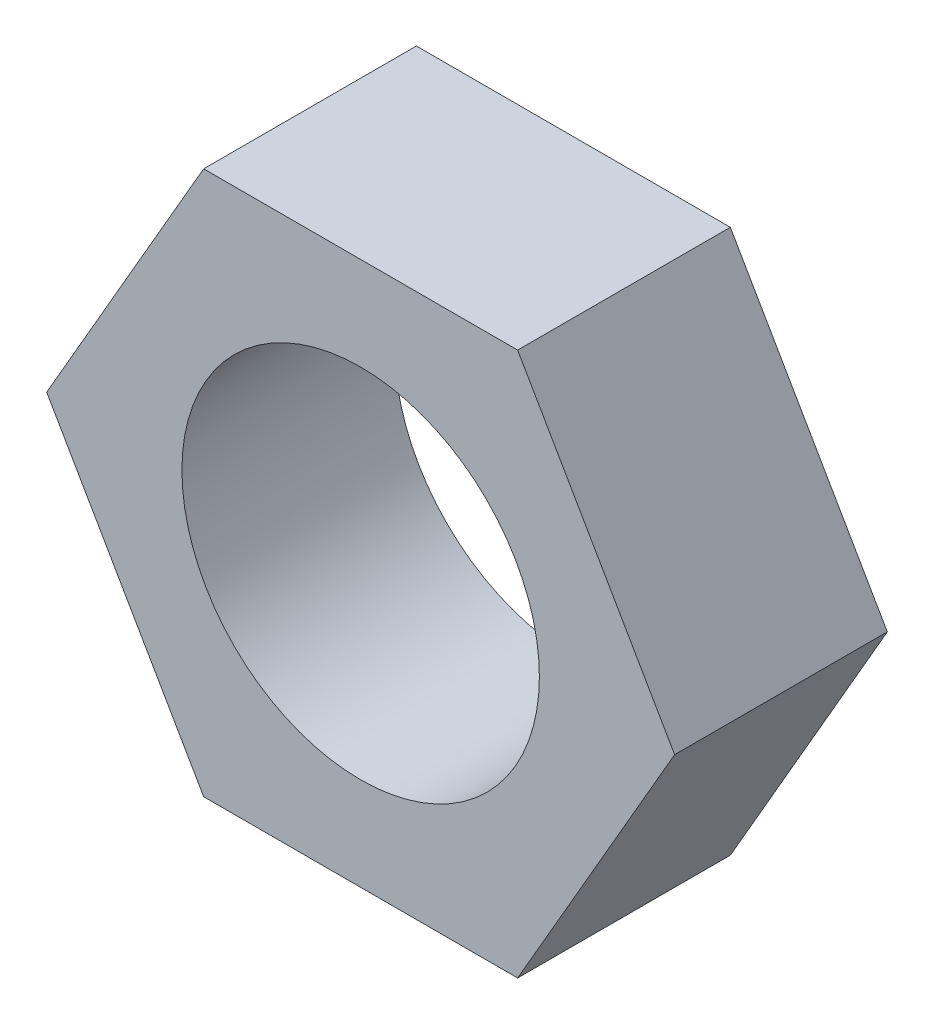
ISO-10303-21;
HEADER;
FILE_DESCRIPTION(('STEP AP214'),'2;1');
FILE_NAME('part.step','',(''),(''),'','','');
FILE_SCHEMA(('AUTOMOTIVE_DESIGN { 1 0 10303 214 1 1 1 1 }'));
ENDSEC;
DATA;
#1=APPLICATION_CONTEXT('core data for automotive mechanical design processes');
#2=APPLICATION_PROTOCOL_DEFINITION('international standard','automotive_design',2000,#1);
#3=PRODUCT_CONTEXT('',#1,'mechanical');
#4=PRODUCT('Part','Part','',(#3));
#5=PRODUCT_RELATED_PRODUCT_CATEGORY('part','',(#4));
#6=PRODUCT_DEFINITION_FORMATION('','',#4);
#7=PRODUCT_DEFINITION_CONTEXT('part definition',#1,'design');
#8=PRODUCT_DEFINITION('design','',#6,#7);
#9=PRODUCT_DEFINITION_SHAPE('','',#8);
#10=(LENGTH_UNIT() NAMED_UNIT(*) SI_UNIT(.MILLI.,.METRE.));
#11=(NAMED_UNIT(*) PLANE_ANGLE_UNIT() SI_UNIT($,.RADIAN.));
#12=(NAMED_UNIT(*) SI_UNIT($,.STERADIAN.) SOLID_ANGLE_UNIT());
#13=UNCERTAINTY_MEASURE_WITH_UNIT(LENGTH_MEASURE(1.E-05),#10,'distance_accuracy_value','');
#14=(GEOMETRIC_REPRESENTATION_CONTEXT(3) GLOBAL_UNCERTAINTY_ASSIGNED_CONTEXT((#13)) GLOBAL_UNIT_ASSIGNED_CONTEXT((#10,
#11,#12)) REPRESENTATION_CONTEXT('',''));
#15=CARTESIAN_POINT('',(0.,0.,0.));
#16=DIRECTION('',(0.,0.,1.));
#17=DIRECTION('',(1.,0.,0.));
#18=AXIS2_PLACEMENT_3D('',#15,#16,#17);
#19=CARTESIAN_POINT('',(3.69030667283093,6.39179865285367,5.));
#20=DIRECTION('',(0.,-1.,0.));
#21=DIRECTION('',(1.,0.,0.));
#22=AXIS2_PLACEMENT_3D('',#19,#20,#21);
#23=PLANE('',#22);
#24=DIRECTION('',(-1.,0.,0.));
#25=VECTOR('',#24,1.);
#26=CARTESIAN_POINT('',(3.69030667283093,6.39179865285367,0.));
#27=LINE('',#26,#25);
#28=CARTESIAN_POINT('',(3.69030667283093,6.39179865285367,0.));
#29=VERTEX_POINT('',#28);
#30=CARTESIAN_POINT('',(-3.69030667283098,6.39179865285364,0.));
#31=VERTEX_POINT('',#30);
#32=EDGE_CURVE('E123',#29,#31,#27,.T.);
#33=ORIENTED_EDGE('',*,*,#32,.T.);
#34=DIRECTION('',(0.,0.,-1.));
#35=VECTOR('',#34,1.);
#36=CARTESIAN_POINT('',(-3.69030667283098,6.39179865285364,5.));
#37=LINE('',#36,#35);
#38=CARTESIAN_POINT('',(-3.69030667283098,6.39179865285364,5.));
#39=VERTEX_POINT('',#38);
#40=EDGE_CURVE('E11',#39,#31,#37,.T.);
#41=ORIENTED_EDGE('',*,*,#40,.F.);
#42=DIRECTION('',(-1.,0.,0.));
#43=VECTOR('',#42,1.);
#44=CARTESIAN_POINT('',(3.69030667283093,6.39179865285367,5.));
#45=LINE('',#44,#43);
#46=CARTESIAN_POINT('',(3.69030667283093,6.39179865285367,5.));
#47=VERTEX_POINT('',#46);
#48=EDGE_CURVE('E134',#47,#39,#45,.T.);
#49=ORIENTED_EDGE('',*,*,#48,.F.);
#50=DIRECTION('',(0.,0.,-1.));
#51=VECTOR('',#50,1.);
#52=CARTESIAN_POINT('',(3.69030667283093,6.39179865285367,5.));
#53=LINE('',#52,#51);
#54=EDGE_CURVE('E119',#47,#29,#53,.T.);
#55=ORIENTED_EDGE('',*,*,#54,.T.);
#56=EDGE_LOOP('',(#33,#41,#49,#55));
#57=FACE_BOUND('',#56,.T.);
#58=ADVANCED_FACE('F39',(#57),#23,.F.);
#59=CARTESIAN_POINT('',(-3.69030667283098,6.39179865285364,5.));
#60=DIRECTION('',(0.866025403784442,-0.499999999999995,0.));
#61=DIRECTION('',(0.499999999999995,0.866025403784442,0.));
#62=AXIS2_PLACEMENT_3D('',#59,#60,#61);
#63=PLANE('',#62);
#64=DIRECTION('',(-0.499999999999995,-0.866025403784441,0.));
#65=VECTOR('',#64,1.);
#66=CARTESIAN_POINT('',(-3.69030667283098,6.39179865285364,0.));
#67=LINE('',#66,#65);
#68=CARTESIAN_POINT('',(-7.38061334566189,0.,0.));
#69=VERTEX_POINT('',#68);
#70=EDGE_CURVE('E126',#31,#69,#67,.T.);
#71=ORIENTED_EDGE('',*,*,#70,.T.);
#72=DIRECTION('',(0.,0.,-1.));
#73=VECTOR('',#72,1.);
#74=CARTESIAN_POINT('',(-7.38061334566189,0.,5.));
#75=LINE('',#74,#73);
#76=CARTESIAN_POINT('',(-7.38061334566189,0.,5.));
#77=VERTEX_POINT('',#76);
#78=EDGE_CURVE('E47',#77,#69,#75,.T.);
#79=ORIENTED_EDGE('',*,*,#78,.F.);
#80=DIRECTION('',(-0.499999999999995,-0.866025403784441,0.));
#81=VECTOR('',#80,1.);
#82=CARTESIAN_POINT('',(-3.69030667283098,6.39179865285364,5.));
#83=LINE('',#82,#81);
#84=EDGE_CURVE('E92',#39,#77,#83,.T.);
#85=ORIENTED_EDGE('',*,*,#84,.F.);
#86=ORIENTED_EDGE('',*,*,#40,.T.);
#87=EDGE_LOOP('',(#71,#79,#85,#86));
#88=FACE_BOUND('',#87,.T.);
#89=ADVANCED_FACE('F159',(#88),#63,.F.);
#90=CARTESIAN_POINT('',(-7.38061334566189,0.,5.));
#91=DIRECTION('',(0.866025403784434,0.500000000000007,0.));
#92=DIRECTION('',(-0.500000000000007,0.866025403784435,0.));
#93=AXIS2_PLACEMENT_3D('',#90,#91,#92);
#94=PLANE('',#93);
#95=DIRECTION('',(0.500000000000007,-0.866025403784435,0.));
#96=VECTOR('',#95,1.);
#97=CARTESIAN_POINT('',(-7.38061334566189,0.,0.));
#98=LINE('',#97,#96);
#99=CARTESIAN_POINT('',(-3.69030667283089,-6.39179865285369,0.));
#100=VERTEX_POINT('',#99);
#101=EDGE_CURVE('E129',#69,#100,#98,.T.);
#102=ORIENTED_EDGE('',*,*,#101,.T.);
#103=DIRECTION('',(0.,0.,-1.));
#104=VECTOR('',#103,1.);
#105=CARTESIAN_POINT('',(-3.69030667283089,-6.39179865285369,5.));
#106=LINE('',#105,#104);
#107=CARTESIAN_POINT('',(-3.69030667283089,-6.39179865285369,5.));
#108=VERTEX_POINT('',#107);
#109=EDGE_CURVE('E114',#108,#100,#106,.T.);
#110=ORIENTED_EDGE('',*,*,#109,.F.);
#111=DIRECTION('',(0.500000000000007,-0.866025403784435,0.));
#112=VECTOR('',#111,1.);
#113=CARTESIAN_POINT('',(-7.38061334566189,0.,5.));
#114=LINE('',#113,#112);
#115=EDGE_CURVE('E105',#77,#108,#114,.T.);
#116=ORIENTED_EDGE('',*,*,#115,.F.);
#117=ORIENTED_EDGE('',*,*,#78,.T.);
#118=EDGE_LOOP('',(#102,#110,#116,#117));
#119=FACE_BOUND('',#118,.T.);
#120=ADVANCED_FACE('F140',(#119),#94,.F.);
#121=CARTESIAN_POINT('',(-3.69030667283089,-6.39179865285369,5.));
#122=DIRECTION('',(0.,1.,0.));
#123=DIRECTION('',(-1.,0.,0.));
#124=AXIS2_PLACEMENT_3D('',#121,#122,#123);
#125=PLANE('',#124);
#126=DIRECTION('',(1.,0.,0.));
#127=VECTOR('',#126,1.);
#128=CARTESIAN_POINT('',(-3.69030667283089,-6.39179865285369,0.));
#129=LINE('',#128,#127);
#130=CARTESIAN_POINT('',(3.69030667283102,-6.39179865285362,0.));
#131=VERTEX_POINT('',#130);
#132=EDGE_CURVE('E113',#100,#131,#129,.T.);
#133=ORIENTED_EDGE('',*,*,#132,.T.);
#134=DIRECTION('',(0.,0.,-1.));
#135=VECTOR('',#134,1.);
#136=CARTESIAN_POINT('',(3.69030667283102,-6.39179865285362,5.));
#137=LINE('',#136,#135);
#138=CARTESIAN_POINT('',(3.69030667283102,-6.39179865285362,5.));
#139=VERTEX_POINT('',#138);
#140=EDGE_CURVE('E110',#139,#131,#137,.T.);
#141=ORIENTED_EDGE('',*,*,#140,.F.);
#142=DIRECTION('',(1.,0.,0.));
#143=VECTOR('',#142,1.);
#144=CARTESIAN_POINT('',(-3.69030667283089,-6.39179865285369,5.));
#145=LINE('',#144,#143);
#146=EDGE_CURVE('E99',#108,#139,#145,.T.);
#147=ORIENTED_EDGE('',*,*,#146,.F.);
#148=ORIENTED_EDGE('',*,*,#109,.T.);
#149=EDGE_LOOP('',(#133,#141,#147,#148));
#150=FACE_BOUND('',#149,.T.);
#151=ADVANCED_FACE('F111',(#150),#125,.F.);
#152=CARTESIAN_POINT('',(3.69030667283102,-6.39179865285362,5.));
#153=DIRECTION('',(-0.866025403784441,0.499999999999995,0.));
#154=DIRECTION('',(-0.499999999999995,-0.866025403784441,0.));
#155=AXIS2_PLACEMENT_3D('',#152,#153,#154);
#156=PLANE('',#155);
#157=DIRECTION('',(0.499999999999995,0.866025403784441,0.));
#158=VECTOR('',#157,1.);
#159=CARTESIAN_POINT('',(3.69030667283102,-6.39179865285362,0.));
#160=LINE('',#159,#158);
#161=CARTESIAN_POINT('',(7.3806133456619,0.,0.));
#162=VERTEX_POINT('',#161);
#163=EDGE_CURVE('E78',#131,#162,#160,.T.);
#164=ORIENTED_EDGE('',*,*,#163,.T.);
#165=DIRECTION('',(0.,0.,-1.));
#166=VECTOR('',#165,1.);
#167=CARTESIAN_POINT('',(7.3806133456619,0.,5.));
#168=LINE('',#167,#166);
#169=CARTESIAN_POINT('',(7.3806133456619,0.,5.));
#170=VERTEX_POINT('',#169);
#171=EDGE_CURVE('E115',#170,#162,#168,.T.);
#172=ORIENTED_EDGE('',*,*,#171,.F.);
#173=DIRECTION('',(0.499999999999995,0.866025403784441,0.));
#174=VECTOR('',#173,1.);
#175=CARTESIAN_POINT('',(3.69030667283102,-6.39179865285362,5.));
#176=LINE('',#175,#174);
#177=EDGE_CURVE('E103',#139,#170,#176,.T.);
#178=ORIENTED_EDGE('',*,*,#177,.F.);
#179=ORIENTED_EDGE('',*,*,#140,.T.);
#180=EDGE_LOOP('',(#164,#172,#178,#179));
#181=FACE_BOUND('',#180,.T.);
#182=ADVANCED_FACE('F117',(#181),#156,.F.);
#183=CARTESIAN_POINT('',(7.3806133456619,0.,5.));
#184=DIRECTION('',(-0.866025403784438,-0.500000000000001,0.));
#185=DIRECTION('',(0.500000000000001,-0.866025403784438,0.));
#186=AXIS2_PLACEMENT_3D('',#183,#184,#185);
#187=PLANE('',#186);
#188=DIRECTION('',(-0.500000000000001,0.866025403784438,0.));
#189=VECTOR('',#188,1.);
#190=CARTESIAN_POINT('',(7.3806133456619,0.,0.));
#191=LINE('',#190,#189);
#192=EDGE_CURVE('E84',#162,#29,#191,.T.);
#193=ORIENTED_EDGE('',*,*,#192,.T.);
#194=ORIENTED_EDGE('',*,*,#54,.F.);
#195=DIRECTION('',(-0.500000000000001,0.866025403784438,0.));
#196=VECTOR('',#195,1.);
#197=CARTESIAN_POINT('',(7.3806133456619,0.,5.));
#198=LINE('',#197,#196);
#199=EDGE_CURVE('E55',#170,#47,#198,.T.);
#200=ORIENTED_EDGE('',*,*,#199,.F.);
#201=ORIENTED_EDGE('',*,*,#171,.T.);
#202=EDGE_LOOP('',(#193,#194,#200,#201));
#203=FACE_BOUND('',#202,.T.);
#204=ADVANCED_FACE('F147',(#203),#187,.F.);
#205=CARTESIAN_POINT('',(0.,0.,5.));
#206=DIRECTION('',(0.,0.,1.));
#207=DIRECTION('',(1.,0.,0.));
#208=AXIS2_PLACEMENT_3D('',#205,#206,#207);
#209=PLANE('',#208);
#210=CARTESIAN_POINT('',(0.,0.,5.));
#211=DIRECTION('',(0.,0.,-1.));
#212=DIRECTION('',(-1.,0.,0.));
#213=AXIS2_PLACEMENT_3D('',#210,#211,#212);
#214=CIRCLE('',#213,4.20153888221592);
#215=CARTESIAN_POINT('',(-4.20153888221592,0.,5.));
#216=VERTEX_POINT('',#215);
#217=EDGE_CURVE('E127',#216,#216,#214,.T.);
#218=ORIENTED_EDGE('',*,*,#217,.T.);
#219=EDGE_LOOP('',(#218));
#220=FACE_BOUND('',#219,.T.);
#221=ORIENTED_EDGE('',*,*,#48,.T.);
#222=ORIENTED_EDGE('',*,*,#84,.T.);
#223=ORIENTED_EDGE('',*,*,#115,.T.);
#224=ORIENTED_EDGE('',*,*,#146,.T.);
#225=ORIENTED_EDGE('',*,*,#177,.T.);
#226=ORIENTED_EDGE('',*,*,#199,.T.);
#227=EDGE_LOOP('',(#221,#222,#223,#224,#225,#226));
#228=FACE_BOUND('',#227,.T.);
#229=ADVANCED_FACE('F101',(#220,#228),#209,.T.);
#230=CARTESIAN_POINT('',(0.,0.,0.));
#231=DIRECTION('',(0.,0.,1.));
#232=DIRECTION('',(1.,0.,0.));
#233=AXIS2_PLACEMENT_3D('',#230,#231,#232);
#234=PLANE('',#233);
#235=CARTESIAN_POINT('',(0.,0.,0.));
#236=DIRECTION('',(0.,0.,-1.));
#237=DIRECTION('',(-1.,0.,0.));
#238=AXIS2_PLACEMENT_3D('',#235,#236,#237);
#239=CIRCLE('',#238,4.20153888221592);
#240=CARTESIAN_POINT('',(-4.20153888221592,0.,0.));
#241=VERTEX_POINT('',#240);
#242=EDGE_CURVE('E246',#241,#241,#239,.T.);
#243=ORIENTED_EDGE('',*,*,#242,.F.);
#244=EDGE_LOOP('',(#243));
#245=FACE_BOUND('',#244,.T.);
#246=ORIENTED_EDGE('',*,*,#32,.F.);
#247=ORIENTED_EDGE('',*,*,#192,.F.);
#248=ORIENTED_EDGE('',*,*,#163,.F.);
#249=ORIENTED_EDGE('',*,*,#132,.F.);
#250=ORIENTED_EDGE('',*,*,#101,.F.);
#251=ORIENTED_EDGE('',*,*,#70,.F.);
#252=EDGE_LOOP('',(#246,#247,#248,#249,#250,#251));
#253=FACE_BOUND('',#252,.T.);
#254=ADVANCED_FACE('F143',(#245,#253),#234,.F.);
#255=CARTESIAN_POINT('',(0.,0.,5.));
#256=DIRECTION('',(0.,0.,-1.));
#257=DIRECTION('',(-1.,0.,0.));
#258=AXIS2_PLACEMENT_3D('',#255,#256,#257);
#259=CYLINDRICAL_SURFACE('',#258,4.20153888221592);
#260=ORIENTED_EDGE('',*,*,#217,.F.);
#261=EDGE_LOOP('',(#260));
#262=FACE_BOUND('',#261,.T.);
#263=ORIENTED_EDGE('',*,*,#242,.T.);
#264=EDGE_LOOP('',(#263));
#265=FACE_BOUND('',#264,.T.);
#266=ADVANCED_FACE('F199',(#262,#265),#259,.F.);
#267=CLOSED_SHELL('',(#58,#89,#120,#151,#182,#204,#229,#254,#266));
#268=MANIFOLD_SOLID_BREP('B2',#267);
#269=ADVANCED_BREP_SHAPE_REPRESENTATION('',(#18,#268),#14);
#270=SHAPE_DEFINITION_REPRESENTATION(#9,#269);
ENDSEC;
END-ISO-10303-21;
